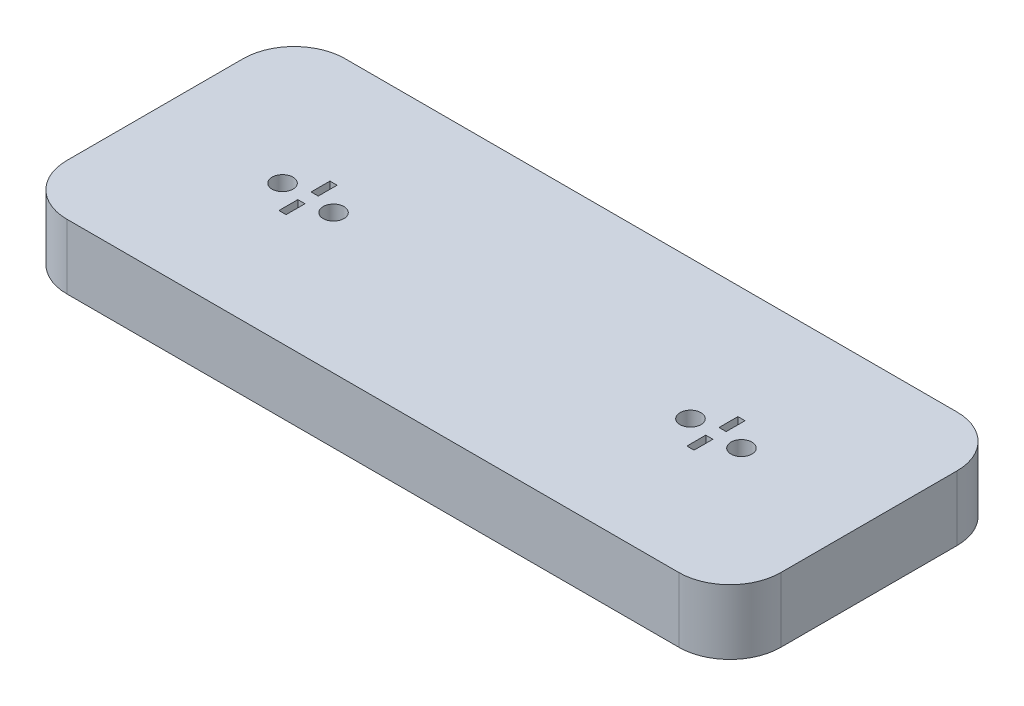
ISO-10303-21;
HEADER;
FILE_DESCRIPTION(('STEP AP214'),'2;1');
FILE_NAME('part.step','',(''),(''),'','','');
FILE_SCHEMA(('AUTOMOTIVE_DESIGN { 1 0 10303 214 1 1 1 1 }'));
ENDSEC;
DATA;
#1=APPLICATION_CONTEXT('core data for automotive mechanical design processes');
#2=APPLICATION_PROTOCOL_DEFINITION('international standard','automotive_design',2000,#1);
#3=PRODUCT_CONTEXT('',#1,'mechanical');
#4=PRODUCT('Part','Part','',(#3));
#5=PRODUCT_RELATED_PRODUCT_CATEGORY('part','',(#4));
#6=PRODUCT_DEFINITION_FORMATION('','',#4);
#7=PRODUCT_DEFINITION_CONTEXT('part definition',#1,'design');
#8=PRODUCT_DEFINITION('design','',#6,#7);
#9=PRODUCT_DEFINITION_SHAPE('','',#8);
#10=(LENGTH_UNIT() NAMED_UNIT(*) SI_UNIT(.MILLI.,.METRE.));
#11=(NAMED_UNIT(*) PLANE_ANGLE_UNIT() SI_UNIT($,.RADIAN.));
#12=(NAMED_UNIT(*) SI_UNIT($,.STERADIAN.) SOLID_ANGLE_UNIT());
#13=UNCERTAINTY_MEASURE_WITH_UNIT(LENGTH_MEASURE(1.E-05),#10,'distance_accuracy_value','');
#14=(GEOMETRIC_REPRESENTATION_CONTEXT(3) GLOBAL_UNCERTAINTY_ASSIGNED_CONTEXT((#13)) GLOBAL_UNIT_ASSIGNED_CONTEXT((#10,
#11,#12)) REPRESENTATION_CONTEXT('',''));
#15=CARTESIAN_POINT('',(0.,0.,0.));
#16=DIRECTION('',(0.,0.,1.));
#17=DIRECTION('',(1.,0.,0.));
#18=AXIS2_PLACEMENT_3D('',#15,#16,#17);
#19=CARTESIAN_POINT('',(5.,6.35,-5.));
#20=DIRECTION('',(0.,-1.,0.));
#21=DIRECTION('',(0.,0.,-1.));
#22=AXIS2_PLACEMENT_3D('',#19,#20,#21);
#23=CYLINDRICAL_SURFACE('',#22,5.);
#24=CARTESIAN_POINT('',(5.,0.,-5.));
#25=DIRECTION('',(0.,1.,0.));
#26=DIRECTION('',(0.,0.,-1.));
#27=AXIS2_PLACEMENT_3D('',#24,#25,#26);
#28=CIRCLE('',#27,5.);
#29=CARTESIAN_POINT('',(0.,0.,-5.00000000000004));
#30=VERTEX_POINT('',#29);
#31=CARTESIAN_POINT('',(5.00000000000004,0.,0.));
#32=VERTEX_POINT('',#31);
#33=EDGE_CURVE('E437',#30,#32,#28,.T.);
#34=ORIENTED_EDGE('',*,*,#33,.T.);
#35=DIRECTION('',(0.,-1.,0.));
#36=VECTOR('',#35,1.);
#37=CARTESIAN_POINT('',(5.00000000000004,6.35,0.));
#38=LINE('',#37,#36);
#39=CARTESIAN_POINT('',(5.00000000000004,6.35,0.));
#40=VERTEX_POINT('',#39);
#41=EDGE_CURVE('E11',#40,#32,#38,.T.);
#42=ORIENTED_EDGE('',*,*,#41,.F.);
#43=CARTESIAN_POINT('',(5.,6.35,-5.));
#44=DIRECTION('',(0.,1.,0.));
#45=DIRECTION('',(0.,0.,-1.));
#46=AXIS2_PLACEMENT_3D('',#43,#44,#45);
#47=CIRCLE('',#46,5.);
#48=CARTESIAN_POINT('',(0.,6.35,-5.00000000000004));
#49=VERTEX_POINT('',#48);
#50=EDGE_CURVE('E410',#49,#40,#47,.T.);
#51=ORIENTED_EDGE('',*,*,#50,.F.);
#52=DIRECTION('',(0.,-1.,0.));
#53=VECTOR('',#52,1.);
#54=CARTESIAN_POINT('',(0.,6.35,-5.00000000000004));
#55=LINE('',#54,#53);
#56=EDGE_CURVE('E436',#49,#30,#55,.T.);
#57=ORIENTED_EDGE('',*,*,#56,.T.);
#58=EDGE_LOOP('',(#34,#42,#51,#57));
#59=FACE_BOUND('',#58,.T.);
#60=ADVANCED_FACE('F39',(#59),#23,.T.);
#61=CARTESIAN_POINT('',(5.00000000000004,6.35,0.));
#62=DIRECTION('',(0.,0.,-1.));
#63=DIRECTION('',(-1.,0.,0.));
#64=AXIS2_PLACEMENT_3D('',#61,#62,#63);
#65=PLANE('',#64);
#66=DIRECTION('',(1.,0.,0.));
#67=VECTOR('',#66,1.);
#68=CARTESIAN_POINT('',(5.00000000000004,0.,0.));
#69=LINE('',#68,#67);
#70=CARTESIAN_POINT('',(65.,0.,0.));
#71=VERTEX_POINT('',#70);
#72=EDGE_CURVE('E441',#32,#71,#69,.T.);
#73=ORIENTED_EDGE('',*,*,#72,.T.);
#74=DIRECTION('',(0.,-1.,0.));
#75=VECTOR('',#74,1.);
#76=CARTESIAN_POINT('',(65.,6.35,0.));
#77=LINE('',#76,#75);
#78=CARTESIAN_POINT('',(65.,6.35,0.));
#79=VERTEX_POINT('',#78);
#80=EDGE_CURVE('E47',#79,#71,#77,.T.);
#81=ORIENTED_EDGE('',*,*,#80,.F.);
#82=DIRECTION('',(1.,0.,0.));
#83=VECTOR('',#82,1.);
#84=CARTESIAN_POINT('',(5.00000000000004,6.35,0.));
#85=LINE('',#84,#83);
#86=EDGE_CURVE('E414',#40,#79,#85,.T.);
#87=ORIENTED_EDGE('',*,*,#86,.F.);
#88=ORIENTED_EDGE('',*,*,#41,.T.);
#89=EDGE_LOOP('',(#73,#81,#87,#88));
#90=FACE_BOUND('',#89,.T.);
#91=ADVANCED_FACE('F512',(#90),#65,.F.);
#92=CARTESIAN_POINT('',(65.,6.35,-5.));
#93=DIRECTION('',(0.,-1.,0.));
#94=DIRECTION('',(0.,0.,-1.));
#95=AXIS2_PLACEMENT_3D('',#92,#93,#94);
#96=CYLINDRICAL_SURFACE('',#95,5.);
#97=CARTESIAN_POINT('',(65.,0.,-5.));
#98=DIRECTION('',(0.,1.,0.));
#99=DIRECTION('',(0.,0.,1.));
#100=AXIS2_PLACEMENT_3D('',#97,#98,#99);
#101=CIRCLE('',#100,5.);
#102=CARTESIAN_POINT('',(70.,0.,-5.00000000000003));
#103=VERTEX_POINT('',#102);
#104=EDGE_CURVE('E445',#71,#103,#101,.T.);
#105=ORIENTED_EDGE('',*,*,#104,.T.);
#106=DIRECTION('',(0.,-1.,0.));
#107=VECTOR('',#106,1.);
#108=CARTESIAN_POINT('',(70.,6.35,-5.00000000000003));
#109=LINE('',#108,#107);
#110=CARTESIAN_POINT('',(70.,6.35,-5.00000000000003));
#111=VERTEX_POINT('',#110);
#112=EDGE_CURVE('E481',#111,#103,#109,.T.);
#113=ORIENTED_EDGE('',*,*,#112,.F.);
#114=CARTESIAN_POINT('',(65.,6.35,-5.));
#115=DIRECTION('',(0.,1.,0.));
#116=DIRECTION('',(0.,0.,1.));
#117=AXIS2_PLACEMENT_3D('',#114,#115,#116);
#118=CIRCLE('',#117,5.);
#119=EDGE_CURVE('E418',#79,#111,#118,.T.);
#120=ORIENTED_EDGE('',*,*,#119,.F.);
#121=ORIENTED_EDGE('',*,*,#80,.T.);
#122=EDGE_LOOP('',(#105,#113,#120,#121));
#123=FACE_BOUND('',#122,.T.);
#124=ADVANCED_FACE('F490',(#123),#96,.T.);
#125=CARTESIAN_POINT('',(70.,6.35,-5.00000000000004));
#126=DIRECTION('',(-1.,0.,0.));
#127=DIRECTION('',(0.,0.,1.));
#128=AXIS2_PLACEMENT_3D('',#125,#126,#127);
#129=PLANE('',#128);
#130=DIRECTION('',(0.,0.,-1.));
#131=VECTOR('',#130,1.);
#132=CARTESIAN_POINT('',(70.,0.,-5.00000000000004));
#133=LINE('',#132,#131);
#134=CARTESIAN_POINT('',(70.,0.,-22.27));
#135=VERTEX_POINT('',#134);
#136=EDGE_CURVE('E448',#103,#135,#133,.T.);
#137=ORIENTED_EDGE('',*,*,#136,.T.);
#138=DIRECTION('',(0.,-1.,0.));
#139=VECTOR('',#138,1.);
#140=CARTESIAN_POINT('',(70.,6.35,-22.27));
#141=LINE('',#140,#139);
#142=CARTESIAN_POINT('',(70.,6.35,-22.27));
#143=VERTEX_POINT('',#142);
#144=EDGE_CURVE('E477',#143,#135,#141,.T.);
#145=ORIENTED_EDGE('',*,*,#144,.F.);
#146=DIRECTION('',(0.,0.,-1.));
#147=VECTOR('',#146,1.);
#148=CARTESIAN_POINT('',(70.,6.35,-5.00000000000004));
#149=LINE('',#148,#147);
#150=EDGE_CURVE('E421',#111,#143,#149,.T.);
#151=ORIENTED_EDGE('',*,*,#150,.F.);
#152=ORIENTED_EDGE('',*,*,#112,.T.);
#153=EDGE_LOOP('',(#137,#145,#151,#152));
#154=FACE_BOUND('',#153,.T.);
#155=ADVANCED_FACE('F500',(#154),#129,.F.);
#156=CARTESIAN_POINT('',(65.,6.35,-22.27));
#157=DIRECTION('',(0.,-1.,0.));
#158=DIRECTION('',(0.,0.,-1.));
#159=AXIS2_PLACEMENT_3D('',#156,#157,#158);
#160=CYLINDRICAL_SURFACE('',#159,5.);
#161=CARTESIAN_POINT('',(65.,0.,-22.27));
#162=DIRECTION('',(0.,1.,0.));
#163=DIRECTION('',(0.,0.,-1.));
#164=AXIS2_PLACEMENT_3D('',#161,#162,#163);
#165=CIRCLE('',#164,5.);
#166=CARTESIAN_POINT('',(65.,0.,-27.27));
#167=VERTEX_POINT('',#166);
#168=EDGE_CURVE('E451',#135,#167,#165,.T.);
#169=ORIENTED_EDGE('',*,*,#168,.T.);
#170=DIRECTION('',(0.,-1.,0.));
#171=VECTOR('',#170,1.);
#172=CARTESIAN_POINT('',(65.,6.35,-27.27));
#173=LINE('',#172,#171);
#174=CARTESIAN_POINT('',(65.,6.35,-27.27));
#175=VERTEX_POINT('',#174);
#176=EDGE_CURVE('E473',#175,#167,#173,.T.);
#177=ORIENTED_EDGE('',*,*,#176,.F.);
#178=CARTESIAN_POINT('',(65.,6.35,-22.27));
#179=DIRECTION('',(0.,1.,0.));
#180=DIRECTION('',(0.,0.,-1.));
#181=AXIS2_PLACEMENT_3D('',#178,#179,#180);
#182=CIRCLE('',#181,5.);
#183=EDGE_CURVE('E424',#143,#175,#182,.T.);
#184=ORIENTED_EDGE('',*,*,#183,.F.);
#185=ORIENTED_EDGE('',*,*,#144,.T.);
#186=EDGE_LOOP('',(#169,#177,#184,#185));
#187=FACE_BOUND('',#186,.T.);
#188=ADVANCED_FACE('F504',(#187),#160,.T.);
#189=CARTESIAN_POINT('',(5.00000000000004,6.35,-27.27));
#190=DIRECTION('',(0.,0.,1.));
#191=DIRECTION('',(1.,0.,0.));
#192=AXIS2_PLACEMENT_3D('',#189,#190,#191);
#193=PLANE('',#192);
#194=DIRECTION('',(-1.,0.,0.));
#195=VECTOR('',#194,1.);
#196=CARTESIAN_POINT('',(5.00000000000004,0.,-27.27));
#197=LINE('',#196,#195);
#198=CARTESIAN_POINT('',(5.00000000000004,0.,-27.27));
#199=VERTEX_POINT('',#198);
#200=EDGE_CURVE('E454',#167,#199,#197,.T.);
#201=ORIENTED_EDGE('',*,*,#200,.T.);
#202=DIRECTION('',(0.,-1.,0.));
#203=VECTOR('',#202,1.);
#204=CARTESIAN_POINT('',(5.00000000000004,6.35,-27.27));
#205=LINE('',#204,#203);
#206=CARTESIAN_POINT('',(5.00000000000004,6.35,-27.27));
#207=VERTEX_POINT('',#206);
#208=EDGE_CURVE('E469',#207,#199,#205,.T.);
#209=ORIENTED_EDGE('',*,*,#208,.F.);
#210=DIRECTION('',(-1.,0.,0.));
#211=VECTOR('',#210,1.);
#212=CARTESIAN_POINT('',(5.00000000000004,6.35,-27.27));
#213=LINE('',#212,#211);
#214=EDGE_CURVE('E427',#175,#207,#213,.T.);
#215=ORIENTED_EDGE('',*,*,#214,.F.);
#216=ORIENTED_EDGE('',*,*,#176,.T.);
#217=EDGE_LOOP('',(#201,#209,#215,#216));
#218=FACE_BOUND('',#217,.T.);
#219=ADVANCED_FACE('F525',(#218),#193,.F.);
#220=CARTESIAN_POINT('',(5.,6.35,-22.27));
#221=DIRECTION('',(0.,-1.,0.));
#222=DIRECTION('',(0.,0.,-1.));
#223=AXIS2_PLACEMENT_3D('',#220,#221,#222);
#224=CYLINDRICAL_SURFACE('',#223,5.);
#225=CARTESIAN_POINT('',(5.,0.,-22.27));
#226=DIRECTION('',(0.,1.,0.));
#227=DIRECTION('',(0.,0.,-1.));
#228=AXIS2_PLACEMENT_3D('',#225,#226,#227);
#229=CIRCLE('',#228,5.);
#230=CARTESIAN_POINT('',(0.,0.,-22.27));
#231=VERTEX_POINT('',#230);
#232=EDGE_CURVE('E457',#199,#231,#229,.T.);
#233=ORIENTED_EDGE('',*,*,#232,.T.);
#234=DIRECTION('',(0.,-1.,0.));
#235=VECTOR('',#234,1.);
#236=CARTESIAN_POINT('',(0.,6.35,-22.27));
#237=LINE('',#236,#235);
#238=CARTESIAN_POINT('',(0.,6.35,-22.27));
#239=VERTEX_POINT('',#238);
#240=EDGE_CURVE('E465',#239,#231,#237,.T.);
#241=ORIENTED_EDGE('',*,*,#240,.F.);
#242=CARTESIAN_POINT('',(5.,6.35,-22.27));
#243=DIRECTION('',(0.,1.,0.));
#244=DIRECTION('',(0.,0.,-1.));
#245=AXIS2_PLACEMENT_3D('',#242,#243,#244);
#246=CIRCLE('',#245,5.);
#247=EDGE_CURVE('E430',#207,#239,#246,.T.);
#248=ORIENTED_EDGE('',*,*,#247,.F.);
#249=ORIENTED_EDGE('',*,*,#208,.T.);
#250=EDGE_LOOP('',(#233,#241,#248,#249));
#251=FACE_BOUND('',#250,.T.);
#252=ADVANCED_FACE('F523',(#251),#224,.T.);
#253=CARTESIAN_POINT('',(0.,6.35,-5.00000000000004));
#254=DIRECTION('',(1.,0.,0.));
#255=DIRECTION('',(0.,0.,-1.));
#256=AXIS2_PLACEMENT_3D('',#253,#254,#255);
#257=PLANE('',#256);
#258=DIRECTION('',(0.,0.,1.));
#259=VECTOR('',#258,1.);
#260=CARTESIAN_POINT('',(0.,0.,-5.00000000000004));
#261=LINE('',#260,#259);
#262=EDGE_CURVE('E415',#231,#30,#261,.T.);
#263=ORIENTED_EDGE('',*,*,#262,.T.);
#264=ORIENTED_EDGE('',*,*,#56,.F.);
#265=DIRECTION('',(0.,0.,1.));
#266=VECTOR('',#265,1.);
#267=CARTESIAN_POINT('',(0.,6.35,-5.00000000000004));
#268=LINE('',#267,#266);
#269=EDGE_CURVE('E433',#239,#49,#268,.T.);
#270=ORIENTED_EDGE('',*,*,#269,.F.);
#271=ORIENTED_EDGE('',*,*,#240,.T.);
#272=EDGE_LOOP('',(#263,#264,#270,#271));
#273=FACE_BOUND('',#272,.T.);
#274=ADVANCED_FACE('F518',(#273),#257,.F.);
#275=CARTESIAN_POINT('',(5.,6.35,-5.));
#276=DIRECTION('',(0.,-1.,0.));
#277=DIRECTION('',(0.,0.,-1.));
#278=AXIS2_PLACEMENT_3D('',#275,#276,#277);
#279=PLANE('',#278);
#280=CARTESIAN_POINT('',(12.5,6.35,-13.635));
#281=DIRECTION('',(0.,1.,0.));
#282=DIRECTION('',(0.,0.,1.));
#283=AXIS2_PLACEMENT_3D('',#280,#281,#282);
#284=CIRCLE('',#283,1.025);
#285=CARTESIAN_POINT('',(12.5,6.35,-12.61));
#286=VERTEX_POINT('',#285);
#287=EDGE_CURVE('E235',#286,#286,#284,.T.);
#288=ORIENTED_EDGE('',*,*,#287,.F.);
#289=EDGE_LOOP('',(#288));
#290=FACE_BOUND('',#289,.T.);
#291=DIRECTION('',(-1.,0.,0.));
#292=VECTOR('',#291,1.);
#293=CARTESIAN_POINT('',(54.65,6.35,-16.135));
#294=LINE('',#293,#292);
#295=CARTESIAN_POINT('',(55.35,6.35,-16.135));
#296=VERTEX_POINT('',#295);
#297=CARTESIAN_POINT('',(54.65,6.35,-16.135));
#298=VERTEX_POINT('',#297);
#299=EDGE_CURVE('E322',#296,#298,#294,.T.);
#300=ORIENTED_EDGE('',*,*,#299,.F.);
#301=DIRECTION('',(0.,0.,-1.));
#302=VECTOR('',#301,1.);
#303=CARTESIAN_POINT('',(55.35,6.35,-14.285));
#304=LINE('',#303,#302);
#305=CARTESIAN_POINT('',(55.35,6.35,-14.285));
#306=VERTEX_POINT('',#305);
#307=EDGE_CURVE('E54',#306,#296,#304,.T.);
#308=ORIENTED_EDGE('',*,*,#307,.F.);
#309=DIRECTION('',(1.,0.,0.));
#310=VECTOR('',#309,1.);
#311=CARTESIAN_POINT('',(54.65,6.35,-14.285));
#312=LINE('',#311,#310);
#313=CARTESIAN_POINT('',(54.65,6.35,-14.285));
#314=VERTEX_POINT('',#313);
#315=EDGE_CURVE('E307',#314,#306,#312,.T.);
#316=ORIENTED_EDGE('',*,*,#315,.F.);
#317=DIRECTION('',(0.,0.,1.));
#318=VECTOR('',#317,1.);
#319=CARTESIAN_POINT('',(54.65,6.35,-14.285));
#320=LINE('',#319,#318);
#321=EDGE_CURVE('E326',#298,#314,#320,.T.);
#322=ORIENTED_EDGE('',*,*,#321,.F.);
#323=EDGE_LOOP('',(#300,#308,#316,#322));
#324=FACE_BOUND('',#323,.T.);
#325=DIRECTION('',(-1.,0.,0.));
#326=VECTOR('',#325,1.);
#327=CARTESIAN_POINT('',(54.65,6.35,-12.985));
#328=LINE('',#327,#326);
#329=CARTESIAN_POINT('',(55.35,6.35,-12.985));
#330=VERTEX_POINT('',#329);
#331=CARTESIAN_POINT('',(54.65,6.35,-12.985));
#332=VERTEX_POINT('',#331);
#333=EDGE_CURVE('E280',#330,#332,#328,.T.);
#334=ORIENTED_EDGE('',*,*,#333,.F.);
#335=DIRECTION('',(0.,0.,-1.));
#336=VECTOR('',#335,1.);
#337=CARTESIAN_POINT('',(55.35,6.35,-12.985));
#338=LINE('',#337,#336);
#339=CARTESIAN_POINT('',(55.35,6.35,-11.135));
#340=VERTEX_POINT('',#339);
#341=EDGE_CURVE('E62',#340,#330,#338,.T.);
#342=ORIENTED_EDGE('',*,*,#341,.F.);
#343=DIRECTION('',(1.,0.,0.));
#344=VECTOR('',#343,1.);
#345=CARTESIAN_POINT('',(54.65,6.35,-11.135));
#346=LINE('',#345,#344);
#347=CARTESIAN_POINT('',(54.65,6.35,-11.135));
#348=VERTEX_POINT('',#347);
#349=EDGE_CURVE('E265',#348,#340,#346,.T.);
#350=ORIENTED_EDGE('',*,*,#349,.F.);
#351=DIRECTION('',(0.,0.,1.));
#352=VECTOR('',#351,1.);
#353=CARTESIAN_POINT('',(54.65,6.35,-12.985));
#354=LINE('',#353,#352);
#355=EDGE_CURVE('E285',#332,#348,#354,.T.);
#356=ORIENTED_EDGE('',*,*,#355,.F.);
#357=EDGE_LOOP('',(#334,#342,#350,#356));
#358=FACE_BOUND('',#357,.T.);
#359=DIRECTION('',(-1.,0.,0.));
#360=VECTOR('',#359,1.);
#361=CARTESIAN_POINT('',(14.65,6.35,-12.985));
#362=LINE('',#361,#360);
#363=CARTESIAN_POINT('',(15.35,6.35,-12.985));
#364=VERTEX_POINT('',#363);
#365=CARTESIAN_POINT('',(14.65,6.35,-12.985));
#366=VERTEX_POINT('',#365);
#367=EDGE_CURVE('E244',#364,#366,#362,.T.);
#368=ORIENTED_EDGE('',*,*,#367,.F.);
#369=DIRECTION('',(0.,0.,-1.));
#370=VECTOR('',#369,1.);
#371=CARTESIAN_POINT('',(15.35,6.35,-12.985));
#372=LINE('',#371,#370);
#373=CARTESIAN_POINT('',(15.35,6.35,-11.135));
#374=VERTEX_POINT('',#373);
#375=EDGE_CURVE('E207',#374,#364,#372,.T.);
#376=ORIENTED_EDGE('',*,*,#375,.F.);
#377=DIRECTION('',(1.,0.,0.));
#378=VECTOR('',#377,1.);
#379=CARTESIAN_POINT('',(14.65,6.35,-11.135));
#380=LINE('',#379,#378);
#381=CARTESIAN_POINT('',(14.65,6.35,-11.135));
#382=VERTEX_POINT('',#381);
#383=EDGE_CURVE('E228',#382,#374,#380,.T.);
#384=ORIENTED_EDGE('',*,*,#383,.F.);
#385=DIRECTION('',(0.,0.,1.));
#386=VECTOR('',#385,1.);
#387=CARTESIAN_POINT('',(14.65,6.35,-12.985));
#388=LINE('',#387,#386);
#389=EDGE_CURVE('E232',#366,#382,#388,.T.);
#390=ORIENTED_EDGE('',*,*,#389,.F.);
#391=EDGE_LOOP('',(#368,#376,#384,#390));
#392=FACE_BOUND('',#391,.T.);
#393=CARTESIAN_POINT('',(17.5,6.35,-13.635));
#394=DIRECTION('',(0.,1.,0.));
#395=DIRECTION('',(0.,0.,1.));
#396=AXIS2_PLACEMENT_3D('',#393,#394,#395);
#397=CIRCLE('',#396,1.025);
#398=CARTESIAN_POINT('',(17.5,6.35,-12.61));
#399=VERTEX_POINT('',#398);
#400=EDGE_CURVE('E399',#399,#399,#397,.T.);
#401=ORIENTED_EDGE('',*,*,#400,.F.);
#402=EDGE_LOOP('',(#401));
#403=FACE_BOUND('',#402,.T.);
#404=CARTESIAN_POINT('',(52.5,6.35,-13.635));
#405=DIRECTION('',(0.,1.,0.));
#406=DIRECTION('',(0.,0.,1.));
#407=AXIS2_PLACEMENT_3D('',#404,#405,#406);
#408=CIRCLE('',#407,1.025);
#409=CARTESIAN_POINT('',(52.5,6.35,-12.61));
#410=VERTEX_POINT('',#409);
#411=EDGE_CURVE('E347',#410,#410,#408,.T.);
#412=ORIENTED_EDGE('',*,*,#411,.F.);
#413=EDGE_LOOP('',(#412));
#414=FACE_BOUND('',#413,.T.);
#415=CARTESIAN_POINT('',(57.5,6.35,-13.635));
#416=DIRECTION('',(0.,1.,0.));
#417=DIRECTION('',(0.,0.,1.));
#418=AXIS2_PLACEMENT_3D('',#415,#416,#417);
#419=CIRCLE('',#418,1.025);
#420=CARTESIAN_POINT('',(57.5,6.35,-12.61));
#421=VERTEX_POINT('',#420);
#422=EDGE_CURVE('E348',#421,#421,#419,.T.);
#423=ORIENTED_EDGE('',*,*,#422,.F.);
#424=EDGE_LOOP('',(#423));
#425=FACE_BOUND('',#424,.T.);
#426=DIRECTION('',(-1.,0.,0.));
#427=VECTOR('',#426,1.);
#428=CARTESIAN_POINT('',(14.65,6.35,-16.135));
#429=LINE('',#428,#427);
#430=CARTESIAN_POINT('',(15.35,6.35,-16.135));
#431=VERTEX_POINT('',#430);
#432=CARTESIAN_POINT('',(14.65,6.35,-16.135));
#433=VERTEX_POINT('',#432);
#434=EDGE_CURVE('E373',#431,#433,#429,.T.);
#435=ORIENTED_EDGE('',*,*,#434,.F.);
#436=DIRECTION('',(0.,0.,-1.));
#437=VECTOR('',#436,1.);
#438=CARTESIAN_POINT('',(15.35,6.35,-16.135));
#439=LINE('',#438,#437);
#440=CARTESIAN_POINT('',(15.35,6.35,-14.285));
#441=VERTEX_POINT('',#440);
#442=EDGE_CURVE('E254',#441,#431,#439,.T.);
#443=ORIENTED_EDGE('',*,*,#442,.F.);
#444=DIRECTION('',(1.,0.,0.));
#445=VECTOR('',#444,1.);
#446=CARTESIAN_POINT('',(14.65,6.35,-14.285));
#447=LINE('',#446,#445);
#448=CARTESIAN_POINT('',(14.65,6.35,-14.285));
#449=VERTEX_POINT('',#448);
#450=EDGE_CURVE('E358',#449,#441,#447,.T.);
#451=ORIENTED_EDGE('',*,*,#450,.F.);
#452=DIRECTION('',(0.,0.,1.));
#453=VECTOR('',#452,1.);
#454=CARTESIAN_POINT('',(14.65,6.35,-16.135));
#455=LINE('',#454,#453);
#456=EDGE_CURVE('E377',#433,#449,#455,.T.);
#457=ORIENTED_EDGE('',*,*,#456,.F.);
#458=EDGE_LOOP('',(#435,#443,#451,#457));
#459=FACE_BOUND('',#458,.T.);
#460=ORIENTED_EDGE('',*,*,#50,.T.);
#461=ORIENTED_EDGE('',*,*,#86,.T.);
#462=ORIENTED_EDGE('',*,*,#119,.T.);
#463=ORIENTED_EDGE('',*,*,#150,.T.);
#464=ORIENTED_EDGE('',*,*,#183,.T.);
#465=ORIENTED_EDGE('',*,*,#214,.T.);
#466=ORIENTED_EDGE('',*,*,#247,.T.);
#467=ORIENTED_EDGE('',*,*,#269,.T.);
#468=EDGE_LOOP('',(#460,#461,#462,#463,#464,#465,#466,#467));
#469=FACE_BOUND('',#468,.T.);
#470=ADVANCED_FACE('F508',(#290,#324,#358,#392,#403,#414,#425,#459,#469),#279,.F.);
#471=CARTESIAN_POINT('',(5.,0.,-5.));
#472=DIRECTION('',(0.,-1.,0.));
#473=DIRECTION('',(0.,0.,-1.));
#474=AXIS2_PLACEMENT_3D('',#471,#472,#473);
#475=PLANE('',#474);
#476=CARTESIAN_POINT('',(12.5,0.,-13.635));
#477=DIRECTION('',(0.,1.,0.));
#478=DIRECTION('',(0.,0.,1.));
#479=AXIS2_PLACEMENT_3D('',#476,#477,#478);
#480=CIRCLE('',#479,1.025);
#481=CARTESIAN_POINT('',(12.5,0.,-12.61));
#482=VERTEX_POINT('',#481);
#483=EDGE_CURVE('E442',#482,#482,#480,.T.);
#484=ORIENTED_EDGE('',*,*,#483,.T.);
#485=EDGE_LOOP('',(#484));
#486=FACE_BOUND('',#485,.T.);
#487=DIRECTION('',(0.,0.,-1.));
#488=VECTOR('',#487,1.);
#489=CARTESIAN_POINT('',(55.35,0.,-14.285));
#490=LINE('',#489,#488);
#491=CARTESIAN_POINT('',(55.35,0.,-14.285));
#492=VERTEX_POINT('',#491);
#493=CARTESIAN_POINT('',(55.35,0.,-16.135));
#494=VERTEX_POINT('',#493);
#495=EDGE_CURVE('E302',#492,#494,#490,.T.);
#496=ORIENTED_EDGE('',*,*,#495,.T.);
#497=DIRECTION('',(-1.,0.,0.));
#498=VECTOR('',#497,1.);
#499=CARTESIAN_POINT('',(54.65,0.,-16.135));
#500=LINE('',#499,#498);
#501=CARTESIAN_POINT('',(54.65,0.,-16.135));
#502=VERTEX_POINT('',#501);
#503=EDGE_CURVE('E306',#494,#502,#500,.T.);
#504=ORIENTED_EDGE('',*,*,#503,.T.);
#505=DIRECTION('',(0.,0.,1.));
#506=VECTOR('',#505,1.);
#507=CARTESIAN_POINT('',(54.65,0.,-14.285));
#508=LINE('',#507,#506);
#509=CARTESIAN_POINT('',(54.65,0.,-14.285));
#510=VERTEX_POINT('',#509);
#511=EDGE_CURVE('E311',#502,#510,#508,.T.);
#512=ORIENTED_EDGE('',*,*,#511,.T.);
#513=DIRECTION('',(1.,0.,0.));
#514=VECTOR('',#513,1.);
#515=CARTESIAN_POINT('',(54.65,0.,-14.285));
#516=LINE('',#515,#514);
#517=EDGE_CURVE('E315',#510,#492,#516,.T.);
#518=ORIENTED_EDGE('',*,*,#517,.T.);
#519=EDGE_LOOP('',(#496,#504,#512,#518));
#520=FACE_BOUND('',#519,.T.);
#521=DIRECTION('',(0.,0.,-1.));
#522=VECTOR('',#521,1.);
#523=CARTESIAN_POINT('',(55.35,0.,-12.985));
#524=LINE('',#523,#522);
#525=CARTESIAN_POINT('',(55.35,0.,-11.135));
#526=VERTEX_POINT('',#525);
#527=CARTESIAN_POINT('',(55.35,0.,-12.985));
#528=VERTEX_POINT('',#527);
#529=EDGE_CURVE('E260',#526,#528,#524,.T.);
#530=ORIENTED_EDGE('',*,*,#529,.T.);
#531=DIRECTION('',(-1.,0.,0.));
#532=VECTOR('',#531,1.);
#533=CARTESIAN_POINT('',(54.65,0.,-12.985));
#534=LINE('',#533,#532);
#535=CARTESIAN_POINT('',(54.65,0.,-12.985));
#536=VERTEX_POINT('',#535);
#537=EDGE_CURVE('E264',#528,#536,#534,.T.);
#538=ORIENTED_EDGE('',*,*,#537,.T.);
#539=DIRECTION('',(0.,0.,1.));
#540=VECTOR('',#539,1.);
#541=CARTESIAN_POINT('',(54.65,0.,-12.985));
#542=LINE('',#541,#540);
#543=CARTESIAN_POINT('',(54.65,0.,-11.135));
#544=VERTEX_POINT('',#543);
#545=EDGE_CURVE('E269',#536,#544,#542,.T.);
#546=ORIENTED_EDGE('',*,*,#545,.T.);
#547=DIRECTION('',(1.,0.,0.));
#548=VECTOR('',#547,1.);
#549=CARTESIAN_POINT('',(54.65,0.,-11.135));
#550=LINE('',#549,#548);
#551=EDGE_CURVE('E273',#544,#526,#550,.T.);
#552=ORIENTED_EDGE('',*,*,#551,.T.);
#553=EDGE_LOOP('',(#530,#538,#546,#552));
#554=FACE_BOUND('',#553,.T.);
#555=DIRECTION('',(0.,0.,-1.));
#556=VECTOR('',#555,1.);
#557=CARTESIAN_POINT('',(15.35,0.,-12.985));
#558=LINE('',#557,#556);
#559=CARTESIAN_POINT('',(15.35,0.,-11.135));
#560=VERTEX_POINT('',#559);
#561=CARTESIAN_POINT('',(15.35,0.,-12.985));
#562=VERTEX_POINT('',#561);
#563=EDGE_CURVE('E204',#560,#562,#558,.T.);
#564=ORIENTED_EDGE('',*,*,#563,.T.);
#565=DIRECTION('',(-1.,0.,0.));
#566=VECTOR('',#565,1.);
#567=CARTESIAN_POINT('',(14.65,0.,-12.985));
#568=LINE('',#567,#566);
#569=CARTESIAN_POINT('',(14.65,0.,-12.985));
#570=VERTEX_POINT('',#569);
#571=EDGE_CURVE('E217',#562,#570,#568,.T.);
#572=ORIENTED_EDGE('',*,*,#571,.T.);
#573=DIRECTION('',(0.,0.,1.));
#574=VECTOR('',#573,1.);
#575=CARTESIAN_POINT('',(14.65,0.,-12.985));
#576=LINE('',#575,#574);
#577=CARTESIAN_POINT('',(14.65,0.,-11.135));
#578=VERTEX_POINT('',#577);
#579=EDGE_CURVE('E222',#570,#578,#576,.T.);
#580=ORIENTED_EDGE('',*,*,#579,.T.);
#581=DIRECTION('',(1.,0.,0.));
#582=VECTOR('',#581,1.);
#583=CARTESIAN_POINT('',(14.65,0.,-11.135));
#584=LINE('',#583,#582);
#585=EDGE_CURVE('E213',#578,#560,#584,.T.);
#586=ORIENTED_EDGE('',*,*,#585,.T.);
#587=EDGE_LOOP('',(#564,#572,#580,#586));
#588=FACE_BOUND('',#587,.T.);
#589=CARTESIAN_POINT('',(17.5,0.,-13.635));
#590=DIRECTION('',(0.,1.,0.));
#591=DIRECTION('',(0.,0.,1.));
#592=AXIS2_PLACEMENT_3D('',#589,#590,#591);
#593=CIRCLE('',#592,1.025);
#594=CARTESIAN_POINT('',(17.5,0.,-12.61));
#595=VERTEX_POINT('',#594);
#596=EDGE_CURVE('E395',#595,#595,#593,.T.);
#597=ORIENTED_EDGE('',*,*,#596,.T.);
#598=EDGE_LOOP('',(#597));
#599=FACE_BOUND('',#598,.T.);
#600=CARTESIAN_POINT('',(52.5,0.,-13.635));
#601=DIRECTION('',(0.,1.,0.));
#602=DIRECTION('',(0.,0.,1.));
#603=AXIS2_PLACEMENT_3D('',#600,#601,#602);
#604=CIRCLE('',#603,1.025);
#605=CARTESIAN_POINT('',(52.5,0.,-12.61));
#606=VERTEX_POINT('',#605);
#607=EDGE_CURVE('E403',#606,#606,#604,.T.);
#608=ORIENTED_EDGE('',*,*,#607,.T.);
#609=EDGE_LOOP('',(#608));
#610=FACE_BOUND('',#609,.T.);
#611=CARTESIAN_POINT('',(57.5,0.,-13.635));
#612=DIRECTION('',(0.,1.,0.));
#613=DIRECTION('',(0.,0.,1.));
#614=AXIS2_PLACEMENT_3D('',#611,#612,#613);
#615=CIRCLE('',#614,1.025);
#616=CARTESIAN_POINT('',(57.5,0.,-12.61));
#617=VERTEX_POINT('',#616);
#618=EDGE_CURVE('E343',#617,#617,#615,.T.);
#619=ORIENTED_EDGE('',*,*,#618,.T.);
#620=EDGE_LOOP('',(#619));
#621=FACE_BOUND('',#620,.T.);
#622=DIRECTION('',(0.,0.,-1.));
#623=VECTOR('',#622,1.);
#624=CARTESIAN_POINT('',(15.35,0.,-16.135));
#625=LINE('',#624,#623);
#626=CARTESIAN_POINT('',(15.35,0.,-14.285));
#627=VERTEX_POINT('',#626);
#628=CARTESIAN_POINT('',(15.35,0.,-16.135));
#629=VERTEX_POINT('',#628);
#630=EDGE_CURVE('E353',#627,#629,#625,.T.);
#631=ORIENTED_EDGE('',*,*,#630,.T.);
#632=DIRECTION('',(-1.,0.,0.));
#633=VECTOR('',#632,1.);
#634=CARTESIAN_POINT('',(14.65,0.,-16.135));
#635=LINE('',#634,#633);
#636=CARTESIAN_POINT('',(14.65,0.,-16.135));
#637=VERTEX_POINT('',#636);
#638=EDGE_CURVE('E357',#629,#637,#635,.T.);
#639=ORIENTED_EDGE('',*,*,#638,.T.);
#640=DIRECTION('',(0.,0.,1.));
#641=VECTOR('',#640,1.);
#642=CARTESIAN_POINT('',(14.65,0.,-16.135));
#643=LINE('',#642,#641);
#644=CARTESIAN_POINT('',(14.65,0.,-14.285));
#645=VERTEX_POINT('',#644);
#646=EDGE_CURVE('E362',#637,#645,#643,.T.);
#647=ORIENTED_EDGE('',*,*,#646,.T.);
#648=DIRECTION('',(1.,0.,0.));
#649=VECTOR('',#648,1.);
#650=CARTESIAN_POINT('',(14.65,0.,-14.285));
#651=LINE('',#650,#649);
#652=EDGE_CURVE('E366',#645,#627,#651,.T.);
#653=ORIENTED_EDGE('',*,*,#652,.T.);
#654=EDGE_LOOP('',(#631,#639,#647,#653));
#655=FACE_BOUND('',#654,.T.);
#656=ORIENTED_EDGE('',*,*,#33,.F.);
#657=ORIENTED_EDGE('',*,*,#262,.F.);
#658=ORIENTED_EDGE('',*,*,#232,.F.);
#659=ORIENTED_EDGE('',*,*,#200,.F.);
#660=ORIENTED_EDGE('',*,*,#168,.F.);
#661=ORIENTED_EDGE('',*,*,#136,.F.);
#662=ORIENTED_EDGE('',*,*,#104,.F.);
#663=ORIENTED_EDGE('',*,*,#72,.F.);
#664=EDGE_LOOP('',(#656,#657,#658,#659,#660,#661,#662,#663));
#665=FACE_BOUND('',#664,.T.);
#666=ADVANCED_FACE('F224',(#486,#520,#554,#588,#599,#610,#621,#655,#665),#475,.T.);
#667=CARTESIAN_POINT('',(15.35,0.,-16.135));
#668=DIRECTION('',(1.,0.,0.));
#669=DIRECTION('',(0.,0.,-1.));
#670=AXIS2_PLACEMENT_3D('',#667,#668,#669);
#671=PLANE('',#670);
#672=ORIENTED_EDGE('',*,*,#442,.T.);
#673=DIRECTION('',(0.,1.,0.));
#674=VECTOR('',#673,1.);
#675=CARTESIAN_POINT('',(15.35,0.,-16.135));
#676=LINE('',#675,#674);
#677=EDGE_CURVE('E370',#629,#431,#676,.T.);
#678=ORIENTED_EDGE('',*,*,#677,.F.);
#679=ORIENTED_EDGE('',*,*,#630,.F.);
#680=DIRECTION('',(0.,1.,0.));
#681=VECTOR('',#680,1.);
#682=CARTESIAN_POINT('',(15.35,0.,-14.285));
#683=LINE('',#682,#681);
#684=EDGE_CURVE('E352',#627,#441,#683,.T.);
#685=ORIENTED_EDGE('',*,*,#684,.T.);
#686=EDGE_LOOP('',(#672,#678,#679,#685));
#687=FACE_BOUND('',#686,.T.);
#688=ADVANCED_FACE('F588',(#687),#671,.F.);
#689=CARTESIAN_POINT('',(14.65,0.,-14.285));
#690=DIRECTION('',(0.,0.,1.));
#691=DIRECTION('',(1.,0.,0.));
#692=AXIS2_PLACEMENT_3D('',#689,#690,#691);
#693=PLANE('',#692);
#694=ORIENTED_EDGE('',*,*,#450,.T.);
#695=ORIENTED_EDGE('',*,*,#684,.F.);
#696=ORIENTED_EDGE('',*,*,#652,.F.);
#697=DIRECTION('',(0.,1.,0.));
#698=VECTOR('',#697,1.);
#699=CARTESIAN_POINT('',(14.65,0.,-14.285));
#700=LINE('',#699,#698);
#701=EDGE_CURVE('E386',#645,#449,#700,.T.);
#702=ORIENTED_EDGE('',*,*,#701,.T.);
#703=EDGE_LOOP('',(#694,#695,#696,#702));
#704=FACE_BOUND('',#703,.T.);
#705=ADVANCED_FACE('F598',(#704),#693,.F.);
#706=CARTESIAN_POINT('',(14.65,0.,-16.135));
#707=DIRECTION('',(-1.,0.,0.));
#708=DIRECTION('',(0.,0.,1.));
#709=AXIS2_PLACEMENT_3D('',#706,#707,#708);
#710=PLANE('',#709);
#711=ORIENTED_EDGE('',*,*,#456,.T.);
#712=ORIENTED_EDGE('',*,*,#701,.F.);
#713=ORIENTED_EDGE('',*,*,#646,.F.);
#714=DIRECTION('',(0.,1.,0.));
#715=VECTOR('',#714,1.);
#716=CARTESIAN_POINT('',(14.65,0.,-16.135));
#717=LINE('',#716,#715);
#718=EDGE_CURVE('E389',#637,#433,#717,.T.);
#719=ORIENTED_EDGE('',*,*,#718,.T.);
#720=EDGE_LOOP('',(#711,#712,#713,#719));
#721=FACE_BOUND('',#720,.T.);
#722=ADVANCED_FACE('F608',(#721),#710,.F.);
#723=CARTESIAN_POINT('',(14.65,0.,-16.135));
#724=DIRECTION('',(0.,0.,-1.));
#725=DIRECTION('',(-1.,0.,0.));
#726=AXIS2_PLACEMENT_3D('',#723,#724,#725);
#727=PLANE('',#726);
#728=ORIENTED_EDGE('',*,*,#434,.T.);
#729=ORIENTED_EDGE('',*,*,#718,.F.);
#730=ORIENTED_EDGE('',*,*,#638,.F.);
#731=ORIENTED_EDGE('',*,*,#677,.T.);
#732=EDGE_LOOP('',(#728,#729,#730,#731));
#733=FACE_BOUND('',#732,.T.);
#734=ADVANCED_FACE('F618',(#733),#727,.F.);
#735=CARTESIAN_POINT('',(57.5,0.,-13.635));
#736=DIRECTION('',(0.,1.,0.));
#737=DIRECTION('',(0.,0.,1.));
#738=AXIS2_PLACEMENT_3D('',#735,#736,#737);
#739=CYLINDRICAL_SURFACE('',#738,1.025);
#740=ORIENTED_EDGE('',*,*,#618,.F.);
#741=EDGE_LOOP('',(#740));
#742=FACE_BOUND('',#741,.T.);
#743=ORIENTED_EDGE('',*,*,#422,.T.);
#744=EDGE_LOOP('',(#743));
#745=FACE_BOUND('',#744,.T.);
#746=ADVANCED_FACE('F628',(#742,#745),#739,.F.);
#747=CARTESIAN_POINT('',(52.5,0.,-13.635));
#748=DIRECTION('',(0.,1.,0.));
#749=DIRECTION('',(0.,0.,1.));
#750=AXIS2_PLACEMENT_3D('',#747,#748,#749);
#751=CYLINDRICAL_SURFACE('',#750,1.025);
#752=ORIENTED_EDGE('',*,*,#607,.F.);
#753=EDGE_LOOP('',(#752));
#754=FACE_BOUND('',#753,.T.);
#755=ORIENTED_EDGE('',*,*,#411,.T.);
#756=EDGE_LOOP('',(#755));
#757=FACE_BOUND('',#756,.T.);
#758=ADVANCED_FACE('F638',(#754,#757),#751,.F.);
#759=CARTESIAN_POINT('',(17.5,0.,-13.635));
#760=DIRECTION('',(0.,1.,0.));
#761=DIRECTION('',(0.,0.,1.));
#762=AXIS2_PLACEMENT_3D('',#759,#760,#761);
#763=CYLINDRICAL_SURFACE('',#762,1.025);
#764=ORIENTED_EDGE('',*,*,#596,.F.);
#765=EDGE_LOOP('',(#764));
#766=FACE_BOUND('',#765,.T.);
#767=ORIENTED_EDGE('',*,*,#400,.T.);
#768=EDGE_LOOP('',(#767));
#769=FACE_BOUND('',#768,.T.);
#770=ADVANCED_FACE('F648',(#766,#769),#763,.F.);
#771=CARTESIAN_POINT('',(15.35,0.,-12.985));
#772=DIRECTION('',(1.,0.,0.));
#773=DIRECTION('',(0.,0.,-1.));
#774=AXIS2_PLACEMENT_3D('',#771,#772,#773);
#775=PLANE('',#774);
#776=ORIENTED_EDGE('',*,*,#375,.T.);
#777=DIRECTION('',(0.,1.,0.));
#778=VECTOR('',#777,1.);
#779=CARTESIAN_POINT('',(15.35,0.,-12.985));
#780=LINE('',#779,#778);
#781=EDGE_CURVE('E200',#562,#364,#780,.T.);
#782=ORIENTED_EDGE('',*,*,#781,.F.);
#783=ORIENTED_EDGE('',*,*,#563,.F.);
#784=DIRECTION('',(0.,1.,0.));
#785=VECTOR('',#784,1.);
#786=CARTESIAN_POINT('',(15.35,0.,-11.135));
#787=LINE('',#786,#785);
#788=EDGE_CURVE('E251',#560,#374,#787,.T.);
#789=ORIENTED_EDGE('',*,*,#788,.T.);
#790=EDGE_LOOP('',(#776,#782,#783,#789));
#791=FACE_BOUND('',#790,.T.);
#792=ADVANCED_FACE('F202',(#791),#775,.F.);
#793=CARTESIAN_POINT('',(14.65,0.,-11.135));
#794=DIRECTION('',(0.,0.,1.));
#795=DIRECTION('',(1.,0.,0.));
#796=AXIS2_PLACEMENT_3D('',#793,#794,#795);
#797=PLANE('',#796);
#798=ORIENTED_EDGE('',*,*,#383,.T.);
#799=ORIENTED_EDGE('',*,*,#788,.F.);
#800=ORIENTED_EDGE('',*,*,#585,.F.);
#801=DIRECTION('',(0.,1.,0.));
#802=VECTOR('',#801,1.);
#803=CARTESIAN_POINT('',(14.65,0.,-11.135));
#804=LINE('',#803,#802);
#805=EDGE_CURVE('E255',#578,#382,#804,.T.);
#806=ORIENTED_EDGE('',*,*,#805,.T.);
#807=EDGE_LOOP('',(#798,#799,#800,#806));
#808=FACE_BOUND('',#807,.T.);
#809=ADVANCED_FACE('F667',(#808),#797,.F.);
#810=CARTESIAN_POINT('',(14.65,0.,-12.985));
#811=DIRECTION('',(-1.,0.,0.));
#812=DIRECTION('',(0.,0.,1.));
#813=AXIS2_PLACEMENT_3D('',#810,#811,#812);
#814=PLANE('',#813);
#815=ORIENTED_EDGE('',*,*,#389,.T.);
#816=ORIENTED_EDGE('',*,*,#805,.F.);
#817=ORIENTED_EDGE('',*,*,#579,.F.);
#818=DIRECTION('',(0.,1.,0.));
#819=VECTOR('',#818,1.);
#820=CARTESIAN_POINT('',(14.65,0.,-12.985));
#821=LINE('',#820,#819);
#822=EDGE_CURVE('E212',#570,#366,#821,.T.);
#823=ORIENTED_EDGE('',*,*,#822,.T.);
#824=EDGE_LOOP('',(#815,#816,#817,#823));
#825=FACE_BOUND('',#824,.T.);
#826=ADVANCED_FACE('F676',(#825),#814,.F.);
#827=CARTESIAN_POINT('',(14.65,0.,-12.985));
#828=DIRECTION('',(0.,0.,-1.));
#829=DIRECTION('',(-1.,0.,0.));
#830=AXIS2_PLACEMENT_3D('',#827,#828,#829);
#831=PLANE('',#830);
#832=ORIENTED_EDGE('',*,*,#367,.T.);
#833=ORIENTED_EDGE('',*,*,#822,.F.);
#834=ORIENTED_EDGE('',*,*,#571,.F.);
#835=ORIENTED_EDGE('',*,*,#781,.T.);
#836=EDGE_LOOP('',(#832,#833,#834,#835));
#837=FACE_BOUND('',#836,.T.);
#838=ADVANCED_FACE('F218',(#837),#831,.F.);
#839=CARTESIAN_POINT('',(55.35,0.,-12.985));
#840=DIRECTION('',(1.,0.,0.));
#841=DIRECTION('',(0.,0.,-1.));
#842=AXIS2_PLACEMENT_3D('',#839,#840,#841);
#843=PLANE('',#842);
#844=ORIENTED_EDGE('',*,*,#341,.T.);
#845=DIRECTION('',(0.,1.,0.));
#846=VECTOR('',#845,1.);
#847=CARTESIAN_POINT('',(55.35,0.,-12.985));
#848=LINE('',#847,#846);
#849=EDGE_CURVE('E277',#528,#330,#848,.T.);
#850=ORIENTED_EDGE('',*,*,#849,.F.);
#851=ORIENTED_EDGE('',*,*,#529,.F.);
#852=DIRECTION('',(0.,1.,0.));
#853=VECTOR('',#852,1.);
#854=CARTESIAN_POINT('',(55.35,0.,-11.135));
#855=LINE('',#854,#853);
#856=EDGE_CURVE('E245',#526,#340,#855,.T.);
#857=ORIENTED_EDGE('',*,*,#856,.T.);
#858=EDGE_LOOP('',(#844,#850,#851,#857));
#859=FACE_BOUND('',#858,.T.);
#860=ADVANCED_FACE('F695',(#859),#843,.F.);
#861=CARTESIAN_POINT('',(54.65,0.,-11.135));
#862=DIRECTION('',(0.,0.,1.));
#863=DIRECTION('',(1.,0.,0.));
#864=AXIS2_PLACEMENT_3D('',#861,#862,#863);
#865=PLANE('',#864);
#866=ORIENTED_EDGE('',*,*,#349,.T.);
#867=ORIENTED_EDGE('',*,*,#856,.F.);
#868=ORIENTED_EDGE('',*,*,#551,.F.);
#869=DIRECTION('',(0.,1.,0.));
#870=VECTOR('',#869,1.);
#871=CARTESIAN_POINT('',(54.65,0.,-11.135));
#872=LINE('',#871,#870);
#873=EDGE_CURVE('E294',#544,#348,#872,.T.);
#874=ORIENTED_EDGE('',*,*,#873,.T.);
#875=EDGE_LOOP('',(#866,#867,#868,#874));
#876=FACE_BOUND('',#875,.T.);
#877=ADVANCED_FACE('F704',(#876),#865,.F.);
#878=CARTESIAN_POINT('',(54.65,0.,-12.985));
#879=DIRECTION('',(-1.,0.,0.));
#880=DIRECTION('',(0.,0.,1.));
#881=AXIS2_PLACEMENT_3D('',#878,#879,#880);
#882=PLANE('',#881);
#883=ORIENTED_EDGE('',*,*,#355,.T.);
#884=ORIENTED_EDGE('',*,*,#873,.F.);
#885=ORIENTED_EDGE('',*,*,#545,.F.);
#886=DIRECTION('',(0.,1.,0.));
#887=VECTOR('',#886,1.);
#888=CARTESIAN_POINT('',(54.65,0.,-12.985));
#889=LINE('',#888,#887);
#890=EDGE_CURVE('E297',#536,#332,#889,.T.);
#891=ORIENTED_EDGE('',*,*,#890,.T.);
#892=EDGE_LOOP('',(#883,#884,#885,#891));
#893=FACE_BOUND('',#892,.T.);
#894=ADVANCED_FACE('F713',(#893),#882,.F.);
#895=CARTESIAN_POINT('',(54.65,0.,-12.985));
#896=DIRECTION('',(0.,0.,-1.));
#897=DIRECTION('',(-1.,0.,0.));
#898=AXIS2_PLACEMENT_3D('',#895,#896,#897);
#899=PLANE('',#898);
#900=ORIENTED_EDGE('',*,*,#333,.T.);
#901=ORIENTED_EDGE('',*,*,#890,.F.);
#902=ORIENTED_EDGE('',*,*,#537,.F.);
#903=ORIENTED_EDGE('',*,*,#849,.T.);
#904=EDGE_LOOP('',(#900,#901,#902,#903));
#905=FACE_BOUND('',#904,.T.);
#906=ADVANCED_FACE('F723',(#905),#899,.F.);
#907=CARTESIAN_POINT('',(55.35,0.,-14.285));
#908=DIRECTION('',(1.,0.,0.));
#909=DIRECTION('',(0.,0.,-1.));
#910=AXIS2_PLACEMENT_3D('',#907,#908,#909);
#911=PLANE('',#910);
#912=ORIENTED_EDGE('',*,*,#307,.T.);
#913=DIRECTION('',(0.,1.,0.));
#914=VECTOR('',#913,1.);
#915=CARTESIAN_POINT('',(55.35,0.,-16.135));
#916=LINE('',#915,#914);
#917=EDGE_CURVE('E319',#494,#296,#916,.T.);
#918=ORIENTED_EDGE('',*,*,#917,.F.);
#919=ORIENTED_EDGE('',*,*,#495,.F.);
#920=DIRECTION('',(0.,1.,0.));
#921=VECTOR('',#920,1.);
#922=CARTESIAN_POINT('',(55.35,0.,-14.285));
#923=LINE('',#922,#921);
#924=EDGE_CURVE('E281',#492,#306,#923,.T.);
#925=ORIENTED_EDGE('',*,*,#924,.T.);
#926=EDGE_LOOP('',(#912,#918,#919,#925));
#927=FACE_BOUND('',#926,.T.);
#928=ADVANCED_FACE('F733',(#927),#911,.F.);
#929=CARTESIAN_POINT('',(54.65,0.,-14.285));
#930=DIRECTION('',(0.,0.,1.));
#931=DIRECTION('',(1.,0.,0.));
#932=AXIS2_PLACEMENT_3D('',#929,#930,#931);
#933=PLANE('',#932);
#934=ORIENTED_EDGE('',*,*,#315,.T.);
#935=ORIENTED_EDGE('',*,*,#924,.F.);
#936=ORIENTED_EDGE('',*,*,#517,.F.);
#937=DIRECTION('',(0.,1.,0.));
#938=VECTOR('',#937,1.);
#939=CARTESIAN_POINT('',(54.65,0.,-14.285));
#940=LINE('',#939,#938);
#941=EDGE_CURVE('E335',#510,#314,#940,.T.);
#942=ORIENTED_EDGE('',*,*,#941,.T.);
#943=EDGE_LOOP('',(#934,#935,#936,#942));
#944=FACE_BOUND('',#943,.T.);
#945=ADVANCED_FACE('F743',(#944),#933,.F.);
#946=CARTESIAN_POINT('',(54.65,0.,-14.285));
#947=DIRECTION('',(-1.,0.,0.));
#948=DIRECTION('',(0.,0.,1.));
#949=AXIS2_PLACEMENT_3D('',#946,#947,#948);
#950=PLANE('',#949);
#951=ORIENTED_EDGE('',*,*,#321,.T.);
#952=ORIENTED_EDGE('',*,*,#941,.F.);
#953=ORIENTED_EDGE('',*,*,#511,.F.);
#954=DIRECTION('',(0.,1.,0.));
#955=VECTOR('',#954,1.);
#956=CARTESIAN_POINT('',(54.65,0.,-16.135));
#957=LINE('',#956,#955);
#958=EDGE_CURVE('E338',#502,#298,#957,.T.);
#959=ORIENTED_EDGE('',*,*,#958,.T.);
#960=EDGE_LOOP('',(#951,#952,#953,#959));
#961=FACE_BOUND('',#960,.T.);
#962=ADVANCED_FACE('F752',(#961),#950,.F.);
#963=CARTESIAN_POINT('',(54.65,0.,-16.135));
#964=DIRECTION('',(0.,0.,-1.));
#965=DIRECTION('',(-1.,0.,0.));
#966=AXIS2_PLACEMENT_3D('',#963,#964,#965);
#967=PLANE('',#966);
#968=ORIENTED_EDGE('',*,*,#299,.T.);
#969=ORIENTED_EDGE('',*,*,#958,.F.);
#970=ORIENTED_EDGE('',*,*,#503,.F.);
#971=ORIENTED_EDGE('',*,*,#917,.T.);
#972=EDGE_LOOP('',(#968,#969,#970,#971));
#973=FACE_BOUND('',#972,.T.);
#974=ADVANCED_FACE('F762',(#973),#967,.F.);
#975=CARTESIAN_POINT('',(12.5,0.,-13.635));
#976=DIRECTION('',(0.,1.,0.));
#977=DIRECTION('',(0.,0.,1.));
#978=AXIS2_PLACEMENT_3D('',#975,#976,#977);
#979=CYLINDRICAL_SURFACE('',#978,1.025);
#980=ORIENTED_EDGE('',*,*,#483,.F.);
#981=EDGE_LOOP('',(#980));
#982=FACE_BOUND('',#981,.T.);
#983=ORIENTED_EDGE('',*,*,#287,.T.);
#984=EDGE_LOOP('',(#983));
#985=FACE_BOUND('',#984,.T.);
#986=ADVANCED_FACE('F772',(#982,#985),#979,.F.);
#987=CLOSED_SHELL('',(#60,#91,#124,#155,#188,#219,#252,#274,#470,#666,#688,#705,#722,#734,#746,
#758,#770,#792,#809,#826,#838,#860,#877,#894,#906,#928,#945,#962,#974,#986));
#988=MANIFOLD_SOLID_BREP('B2',#987);
#989=ADVANCED_BREP_SHAPE_REPRESENTATION('',(#18,#988),#14);
#990=SHAPE_DEFINITION_REPRESENTATION(#9,#989);
ENDSEC;
END-ISO-10303-21;
